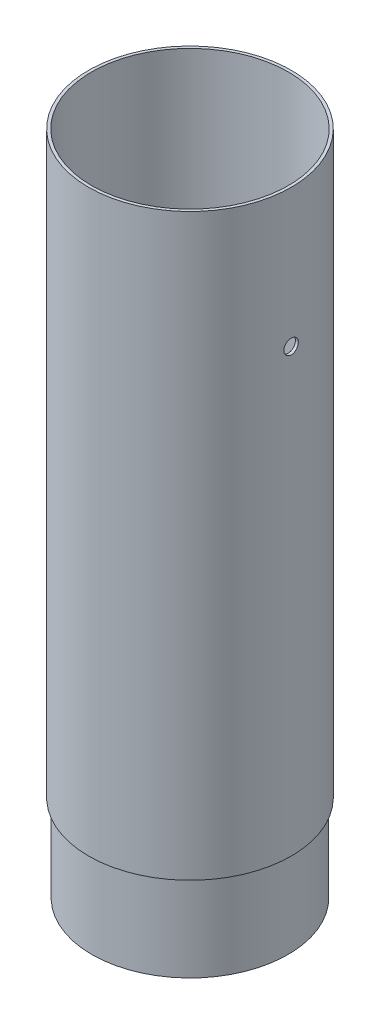
ISO-10303-21;
HEADER;
FILE_DESCRIPTION(('STEP AP214'),'2;1');
FILE_NAME('part.step','',(''),(''),'','','');
FILE_SCHEMA(('AUTOMOTIVE_DESIGN { 1 0 10303 214 1 1 1 1 }'));
ENDSEC;
DATA;
#1=APPLICATION_CONTEXT('core data for automotive mechanical design processes');
#2=APPLICATION_PROTOCOL_DEFINITION('international standard','automotive_design',2000,#1);
#3=PRODUCT_CONTEXT('',#1,'mechanical');
#4=PRODUCT('Part','Part','',(#3));
#5=PRODUCT_RELATED_PRODUCT_CATEGORY('part','',(#4));
#6=PRODUCT_DEFINITION_FORMATION('','',#4);
#7=PRODUCT_DEFINITION_CONTEXT('part definition',#1,'design');
#8=PRODUCT_DEFINITION('design','',#6,#7);
#9=PRODUCT_DEFINITION_SHAPE('','',#8);
#10=(LENGTH_UNIT() NAMED_UNIT(*) SI_UNIT(.MILLI.,.METRE.));
#11=(NAMED_UNIT(*) PLANE_ANGLE_UNIT() SI_UNIT($,.RADIAN.));
#12=(NAMED_UNIT(*) SI_UNIT($,.STERADIAN.) SOLID_ANGLE_UNIT());
#13=UNCERTAINTY_MEASURE_WITH_UNIT(LENGTH_MEASURE(1.E-05),#10,'distance_accuracy_value','');
#14=(GEOMETRIC_REPRESENTATION_CONTEXT(3) GLOBAL_UNCERTAINTY_ASSIGNED_CONTEXT((#13)) GLOBAL_UNIT_ASSIGNED_CONTEXT((#10,
#11,#12)) REPRESENTATION_CONTEXT('',''));
#15=CARTESIAN_POINT('',(0.,0.,0.));
#16=DIRECTION('',(0.,0.,1.));
#17=DIRECTION('',(1.,0.,0.));
#18=AXIS2_PLACEMENT_3D('',#15,#16,#17);
#19=CARTESIAN_POINT('',(0.,200.,0.));
#20=DIRECTION('',(0.,-1.,0.));
#21=DIRECTION('',(0.,0.,-1.));
#22=AXIS2_PLACEMENT_3D('',#19,#20,#21);
#23=CYLINDRICAL_SURFACE('',#22,34.);
#24=CARTESIAN_POINT('',(0.,2.,0.));
#25=DIRECTION('',(0.,-1.,0.));
#26=DIRECTION('',(0.,0.,-1.));
#27=AXIS2_PLACEMENT_3D('',#24,#25,#26);
#28=CIRCLE('',#27,34.);
#29=CARTESIAN_POINT('',(0.,2.,-34.));
#30=VERTEX_POINT('',#29);
#31=EDGE_CURVE('E62',#30,#30,#28,.T.);
#32=ORIENTED_EDGE('',*,*,#31,.T.);
#33=EDGE_LOOP('',(#32));
#34=FACE_BOUND('',#33,.T.);
#35=CARTESIAN_POINT('',(0.,200.,0.));
#36=DIRECTION('',(0.,1.,0.));
#37=DIRECTION('',(0.,0.,1.));
#38=AXIS2_PLACEMENT_3D('',#35,#36,#37);
#39=CIRCLE('',#38,34.);
#40=CARTESIAN_POINT('',(0.,200.,34.));
#41=VERTEX_POINT('',#40);
#42=EDGE_CURVE('E58',#41,#41,#39,.T.);
#43=ORIENTED_EDGE('',*,*,#42,.T.);
#44=EDGE_LOOP('',(#43));
#45=FACE_BOUND('',#44,.T.);
#46=CARTESIAN_POINT('',(33.907963666372,152.404493747876,2.5));
#47=CARTESIAN_POINT('',(33.9079648918879,152.264271450873,2.49999385115886));
#48=CARTESIAN_POINT('',(33.9088428338827,152.123952313681,2.48816295773379));
#49=CARTESIAN_POINT('',(33.9122599324509,151.84719249102,2.44113919356769));
#50=CARTESIAN_POINT('',(33.9148009972329,151.710756448743,2.40591948664322));
#51=CARTESIAN_POINT('',(33.9212549777814,151.445811534043,2.31313865752579));
#52=CARTESIAN_POINT('',(33.9251671428328,151.317298368816,2.25558975933475));
#53=CARTESIAN_POINT('',(33.9339215730292,151.07178802686,2.11980492745823));
#54=CARTESIAN_POINT('',(33.9387636321237,150.954788307596,2.04157357524779));
#55=CARTESIAN_POINT('',(33.9488433291914,150.735356606308,1.86647210116298));
#56=CARTESIAN_POINT('',(33.9540816616156,150.632951149881,1.76956877533338));
#57=CARTESIAN_POINT('',(33.9643572699528,150.445842398467,1.55994366867853));
#58=CARTESIAN_POINT('',(33.9693945372775,150.361139858988,1.4472212130832));
#59=CARTESIAN_POINT('',(33.9787067818083,150.211755932969,1.20900300569948));
#60=CARTESIAN_POINT('',(33.9829808992197,150.147097068823,1.08349309389431));
#61=CARTESIAN_POINT('',(33.9902778466821,150.039780028755,0.823361768729553));
#62=CARTESIAN_POINT('',(33.9933006943227,149.997121543561,0.688740483483281));
#63=CARTESIAN_POINT('',(33.9977496760966,149.935091358264,0.414468302760049));
#64=CARTESIAN_POINT('',(33.9991787133142,149.915677314253,0.274827031735735));
#65=CARTESIAN_POINT('',(34.0002888699552,149.900556271288,-0.00573895675876239));
#66=CARTESIAN_POINT('',(33.9999700154102,149.904848919267,-0.146663655083535));
#67=CARTESIAN_POINT('',(33.9976227233411,149.936984633939,-0.425509205847037));
#68=CARTESIAN_POINT('',(33.9955975917014,149.964782160679,-0.563435338255793));
#69=CARTESIAN_POINT('',(33.9900694375711,150.043067822714,-0.832658708515003));
#70=CARTESIAN_POINT('',(33.9865664036868,150.09355613294,-0.963955895251886));
#71=CARTESIAN_POINT('',(33.9784710074613,150.215841351834,-1.21633989933395));
#72=CARTESIAN_POINT('',(33.9738775970633,150.287658778575,-1.33741674027552));
#73=CARTESIAN_POINT('',(33.9641180316301,150.450548689405,-1.56581421256311));
#74=CARTESIAN_POINT('',(33.9589518675936,150.541621476129,-1.67313462765772));
#75=CARTESIAN_POINT('',(33.9486133725684,150.74069382199,-1.87123884571429));
#76=CARTESIAN_POINT('',(33.9434410559196,150.848732929844,-1.96198291215598));
#77=CARTESIAN_POINT('',(33.9336855761844,151.078532890997,-2.12405186355943));
#78=CARTESIAN_POINT('',(33.9291024134423,151.200293752314,-2.19537673717448));
#79=CARTESIAN_POINT('',(33.9210430700317,151.45410744316,-2.31658047391812));
#80=CARTESIAN_POINT('',(33.9175669856576,151.586161166728,-2.3664574716278));
#81=CARTESIAN_POINT('',(33.9121169953829,151.856799631658,-2.4433212199658));
#82=CARTESIAN_POINT('',(33.910143064966,151.995384266393,-2.47030834417309));
#83=CARTESIAN_POINT('',(33.9079246237389,152.274803490742,-2.50057638080411));
#84=CARTESIAN_POINT('',(33.9076760769926,152.415632056793,-2.50391261665755));
#85=CARTESIAN_POINT('',(33.908925879665,152.695846619324,-2.48692890414879));
#86=CARTESIAN_POINT('',(33.9104242164443,152.835232626234,-2.46660912694516));
#87=CARTESIAN_POINT('',(33.9149952665532,153.108447797837,-2.4029362298222));
#88=CARTESIAN_POINT('',(33.9180662267465,153.242282971299,-2.35960875654355));
#89=CARTESIAN_POINT('',(33.9254350116868,153.500783184817,-2.25117639736865));
#90=CARTESIAN_POINT('',(33.9297328518108,153.625448109915,-2.18607123852401));
#91=CARTESIAN_POINT('',(33.9390808988767,153.86232270165,-2.03579091157234));
#92=CARTESIAN_POINT('',(33.9441324853179,153.974508858526,-1.95057877403379));
#93=CARTESIAN_POINT('',(33.9544140610424,154.183004147637,-1.76255695014023));
#94=CARTESIAN_POINT('',(33.959644052723,154.27931306642,-1.65974702724053));
#95=CARTESIAN_POINT('',(33.9697050443321,154.453507869419,-1.43920944320117));
#96=CARTESIAN_POINT('',(33.9745352556936,154.531357881846,-1.32145340732261));
#97=CARTESIAN_POINT('',(33.9832411025386,154.666179208989,-1.07450828926196));
#98=CARTESIAN_POINT('',(33.9871167457291,154.723150692269,-0.945319299395866));
#99=CARTESIAN_POINT('',(33.9934730844645,154.814535740217,-0.679305699153807));
#100=CARTESIAN_POINT('',(33.995955167632,154.848971750018,-0.542488833958011));
#101=CARTESIAN_POINT('',(33.9992503091375,154.894381746246,-0.264996257550447));
#102=CARTESIAN_POINT('',(34.0000633913812,154.905356068724,-0.124320601638866));
#103=CARTESIAN_POINT('',(33.9999289754249,154.903527614942,0.156541992823156));
#104=CARTESIAN_POINT('',(33.9989856252468,154.890780858838,0.296729301480555));
#105=CARTESIAN_POINT('',(33.9954525921598,154.841988567489,0.572966909930298));
#106=CARTESIAN_POINT('',(33.9928629066461,154.805942995378,0.709017203176361));
#107=CARTESIAN_POINT('',(33.9863280163303,154.711589768643,0.973124722063291));
#108=CARTESIAN_POINT('',(33.9823828507412,154.65328275802,1.10118217880427));
#109=CARTESIAN_POINT('',(33.973579167729,154.516068695787,1.34569872415968));
#110=CARTESIAN_POINT('',(33.9687206694065,154.437162074968,1.46215805525034));
#111=CARTESIAN_POINT('',(33.9586225900774,154.2607792947,1.6804583496611));
#112=CARTESIAN_POINT('',(33.953382181388,154.163262014711,1.78226604940155));
#113=CARTESIAN_POINT('',(33.9431178331084,153.952493420285,1.96810537163221));
#114=CARTESIAN_POINT('',(33.9380939465238,153.839238281492,2.05213266086138));
#115=CARTESIAN_POINT('',(33.9288229192452,153.600035295228,2.20011324041026));
#116=CARTESIAN_POINT('',(33.9245769941091,153.474068053446,2.26403522617316));
#117=CARTESIAN_POINT('',(33.9173577687116,153.213246447451,2.36974160681816));
#118=CARTESIAN_POINT('',(33.914382992203,153.078402603354,2.41155169482286));
#119=CARTESIAN_POINT('',(33.9108153324977,152.853038994167,2.46108809300857));
#120=CARTESIAN_POINT('',(33.9097508037713,152.763972513233,2.47566092969208));
#121=CARTESIAN_POINT('',(33.9083245774052,152.584781949253,2.49511885034471));
#122=CARTESIAN_POINT('',(33.9079628783549,152.49465786833,2.50000395375675));
#123=CARTESIAN_POINT('',(33.907963666372,152.404493747876,2.5));
#124=B_SPLINE_CURVE_WITH_KNOTS('',3,(#46,#47,#48,#49,#50,#51,#52,#53,#54,#55,#56,#57,#58,#59,
#60,#61,#62,#63,#64,#65,#66,#67,#68,#69,#70,#71,#72,#73,#74,#75,#76,#77,#78,#79,#80,#81,#82,#83,
#84,#85,#86,#87,#88,#89,#90,#91,#92,#93,#94,#95,#96,#97,#98,#99,#100,#101,#102,#103,#104,#105,
#106,#107,#108,#109,#110,#111,#112,#113,#114,#115,#116,#117,#118,#119,#120,#121,#122,#123),
.UNSPECIFIED.,.T.,.F.,(4,2,2,2,2,2,2,2,2,2,2,2,2,2,2,2,2,2,2,2,2,2,2,2,2,2,2,2,2,2,2,2,2,2,2,2,
2,2,4),(0.,0.420337711220763,0.841158550622415,1.26174933810786,1.68224703634958,
2.10349951483656,2.52476996744881,2.9465120856445,3.3682482750342,3.78921502191645,
4.21017549931768,4.6303222430804,5.05047222595871,5.4710276989404,5.8915897822557,
6.31314716518915,6.73470479443961,7.15629908105415,7.57788648681858,7.9984874019252,
8.41908527387311,8.83921528722136,9.25935056642374,9.68026442516074,10.1011839421526,
10.5229148616212,10.9446423761116,11.3659492118039,11.7872500129145,12.2075571243501,
12.6278649008317,13.04816051915,13.4684473487119,13.8896737910458,14.3110027724763,
14.7329845648351,15.1544749482645,15.4247561866912,15.6950368826727),.UNSPECIFIED.);
#125=CARTESIAN_POINT('',(33.907963666372,152.404493747876,2.5));
#126=VERTEX_POINT('',#125);
#127=EDGE_CURVE('E74',#126,#126,#124,.T.);
#128=ORIENTED_EDGE('',*,*,#127,.T.);
#129=EDGE_LOOP('',(#128));
#130=FACE_BOUND('',#129,.T.);
#131=ADVANCED_FACE('F37',(#34,#45,#130),#23,.F.);
#132=CARTESIAN_POINT('',(0.,200.,0.));
#133=DIRECTION('',(0.,-1.,0.));
#134=DIRECTION('',(0.,0.,-1.));
#135=AXIS2_PLACEMENT_3D('',#132,#133,#134);
#136=CYLINDRICAL_SURFACE('',#135,35.);
#137=CARTESIAN_POINT('',(0.,200.,0.));
#138=DIRECTION('',(0.,1.,0.));
#139=DIRECTION('',(0.,0.,1.));
#140=AXIS2_PLACEMENT_3D('',#137,#138,#139);
#141=CIRCLE('',#140,35.);
#142=CARTESIAN_POINT('',(0.,200.,35.));
#143=VERTEX_POINT('',#142);
#144=EDGE_CURVE('E50',#143,#143,#141,.T.);
#145=ORIENTED_EDGE('',*,*,#144,.F.);
#146=EDGE_LOOP('',(#145));
#147=FACE_BOUND('',#146,.T.);
#148=CARTESIAN_POINT('',(0.,0.,0.));
#149=DIRECTION('',(0.,1.,0.));
#150=DIRECTION('',(0.,0.,1.));
#151=AXIS2_PLACEMENT_3D('',#148,#149,#150);
#152=CIRCLE('',#151,35.);
#153=CARTESIAN_POINT('',(0.,0.,35.));
#154=VERTEX_POINT('',#153);
#155=EDGE_CURVE('E54',#154,#154,#152,.T.);
#156=ORIENTED_EDGE('',*,*,#155,.T.);
#157=EDGE_LOOP('',(#156));
#158=FACE_BOUND('',#157,.T.);
#159=CARTESIAN_POINT('',(34.9106001094224,152.404493747876,2.5));
#160=CARTESIAN_POINT('',(34.9106013009842,152.264259963494,2.49999384622089));
#161=CARTESIAN_POINT('',(34.9114541660582,152.12392905807,2.48816102267757));
#162=CARTESIAN_POINT('',(34.9147737042987,151.847145233951,2.44112914296743));
#163=CARTESIAN_POINT('',(34.9172422362129,151.710696970945,2.40590317341537));
#164=CARTESIAN_POINT('',(34.9235120866206,151.445727550525,2.3131047340597));
#165=CARTESIAN_POINT('',(34.9273126809974,151.317202130756,2.25554440352311));
#166=CARTESIAN_POINT('',(34.935817508379,151.071669697386,2.11973160545789));
#167=CARTESIAN_POINT('',(34.9405215398181,150.954660123276,2.04148375205725));
#168=CARTESIAN_POINT('',(34.9503133990893,150.73522356434,1.86635343582881));
#169=CARTESIAN_POINT('',(34.9554018656616,150.632821703223,1.76943952624668));
#170=CARTESIAN_POINT('',(34.9653833491045,150.445722784868,1.55979386399035));
#171=CARTESIAN_POINT('',(34.9702763576651,150.361026479743,1.44706143970107));
#172=CARTESIAN_POINT('',(34.979321378548,150.211662689781,1.20883323290625));
#173=CARTESIAN_POINT('',(34.9834726035498,150.147016432933,1.08332410847659));
#174=CARTESIAN_POINT('',(34.990559516592,150.039723649896,0.823198604146603));
#175=CARTESIAN_POINT('',(34.9934952208912,149.99707682944,0.688582346091654));
#176=CARTESIAN_POINT('',(34.9978158775822,149.935064425968,0.41430967348407));
#177=CARTESIAN_POINT('',(34.9992034916227,149.915658879738,0.274662337109951));
#178=CARTESIAN_POINT('',(35.0002806084736,149.900556412171,-0.00591390353004123));
#179=CARTESIAN_POINT('',(34.9999701353268,149.904859155156,-0.146842789622615));
#180=CARTESIAN_POINT('',(34.9976882707688,149.93701827952,-0.425710880401191));
#181=CARTESIAN_POINT('',(34.9957199102546,149.964831679797,-0.563655069919057));
#182=CARTESIAN_POINT('',(34.9903472796657,150.043155846207,-0.832911896068628));
#183=CARTESIAN_POINT('',(34.9869429990408,150.093666779109,-0.964224483967661));
#184=CARTESIAN_POINT('',(34.9790764811396,150.216000560148,-1.21662813510536));
#185=CARTESIAN_POINT('',(34.9746132821527,150.287842796399,-1.33770977022083));
#186=CARTESIAN_POINT('',(34.9651309405076,150.450785756796,-1.56611151883488));
#187=CARTESIAN_POINT('',(34.9601117896154,150.541886766193,-1.67343142846341));
#188=CARTESIAN_POINT('',(34.9500688682286,150.741003800185,-1.87151434561124));
#189=CARTESIAN_POINT('',(34.945045112451,150.849057147096,-1.96223984092648));
#190=CARTESIAN_POINT('',(34.9355705444722,151.078881135,-2.1242691127521));
#191=CARTESIAN_POINT('',(34.931119732582,151.200651783437,-2.19557287872281));
#192=CARTESIAN_POINT('',(34.923293875589,151.454478581857,-2.31673245908851));
#193=CARTESIAN_POINT('',(34.9199189169749,151.586535557706,-2.36658654923886));
#194=CARTESIAN_POINT('',(34.9146282757894,151.857174827485,-2.4434049696103));
#195=CARTESIAN_POINT('',(34.9127125707554,151.995757020937,-2.47036965217411));
#196=CARTESIAN_POINT('',(34.9105607163688,152.275185268371,-2.50059679826771));
#197=CARTESIAN_POINT('',(34.9103208674152,152.416025647297,-2.50391147163281));
#198=CARTESIAN_POINT('',(34.911538102081,152.696260254137,-2.48688105832807));
#199=CARTESIAN_POINT('',(34.9129951741237,152.835654491912,-2.4665361330675));
#200=CARTESIAN_POINT('',(34.9174386845258,153.108891405354,-2.40280747129512));
#201=CARTESIAN_POINT('',(34.9204235182308,153.242739746915,-2.35944790599135));
#202=CARTESIAN_POINT('',(34.9275848607993,153.501260537478,-2.25094529934471));
#203=CARTESIAN_POINT('',(34.9317613837642,153.625932877876,-2.18580200022983));
#204=CARTESIAN_POINT('',(34.9408444549612,153.862802145509,-2.03544819945194));
#205=CARTESIAN_POINT('',(34.9457522675833,153.974976865523,-1.95020278976709));
#206=CARTESIAN_POINT('',(34.9557405275265,154.1834426672,-1.76211522324266));
#207=CARTESIAN_POINT('',(34.9608209770392,154.279733547125,-1.65927284293909));
#208=CARTESIAN_POINT('',(34.9705929477922,154.45387541242,-1.43868558630043));
#209=CARTESIAN_POINT('',(34.9752837452292,154.531692558568,-1.32091395926635));
#210=CARTESIAN_POINT('',(34.9837374668193,154.66644621515,-1.07394533913419));
#211=CARTESIAN_POINT('',(34.9875003981072,154.723382886144,-0.944748433899824));
#212=CARTESIAN_POINT('',(34.9936710038533,154.814700798644,-0.678719845089269));
#213=CARTESIAN_POINT('',(34.9960799531813,154.849103262763,-0.541895477216701));
#214=CARTESIAN_POINT('',(34.9992762933682,154.894445619809,-0.264394743307918));
#215=CARTESIAN_POINT('',(35.0000637059758,154.905385827422,-0.123718428961316));
#216=CARTESIAN_POINT('',(34.9999283072413,154.903489852515,0.157158551507445));
#217=CARTESIAN_POINT('',(34.9990092986799,154.890706538189,0.297359579385099));
#218=CARTESIAN_POINT('',(34.9955718973575,154.841836259151,0.57361871666884));
#219=CARTESIAN_POINT('',(34.9930535020032,154.805749256655,0.70967681935717));
#220=CARTESIAN_POINT('',(34.9867001855665,154.711308562873,0.973793948539721));
#221=CARTESIAN_POINT('',(34.9828652960377,154.652955405256,1.1018531666635));
#222=CARTESIAN_POINT('',(34.974308953845,154.515645493009,1.34636475268572));
#223=CARTESIAN_POINT('',(34.9695875206225,154.43668919018,1.46281737502472));
#224=CARTESIAN_POINT('',(34.9597762099301,154.260216990779,1.68107963152584));
#225=CARTESIAN_POINT('',(34.9546855778527,154.162662378573,1.78285792822938));
#226=CARTESIAN_POINT('',(34.9447158885714,153.951824375959,1.96863172921552));
#227=CARTESIAN_POINT('',(34.9398368832279,153.838537158436,2.05262289400754));
#228=CARTESIAN_POINT('',(34.9308348795402,153.599285170802,2.20052035377929));
#229=CARTESIAN_POINT('',(34.9267130155451,153.473301809624,2.26439661324422));
#230=CARTESIAN_POINT('',(34.9197061867511,153.212458277197,2.37001000657716));
#231=CARTESIAN_POINT('',(34.9168197844766,153.07760863398,2.41177288314436));
#232=CARTESIAN_POINT('',(34.9133616093181,152.85237004228,2.46120496726511));
#233=CARTESIAN_POINT('',(34.9123307263929,152.763434299889,2.47573408624047));
#234=CARTESIAN_POINT('',(34.9109495946006,152.584510295705,2.49513356886052));
#235=CARTESIAN_POINT('',(34.910599344455,152.494522035888,2.50000395064713));
#236=CARTESIAN_POINT('',(34.9106001094224,152.404493747876,2.5));
#237=B_SPLINE_CURVE_WITH_KNOTS('',3,(#159,#160,#161,#162,#163,#164,#165,#166,#167,#168,#169,
#170,#171,#172,#173,#174,#175,#176,#177,#178,#179,#180,#181,#182,#183,#184,#185,#186,#187,#188,
#189,#190,#191,#192,#193,#194,#195,#196,#197,#198,#199,#200,#201,#202,#203,#204,#205,#206,#207,
#208,#209,#210,#211,#212,#213,#214,#215,#216,#217,#218,#219,#220,#221,#222,#223,#224,#225,#226,
#227,#228,#229,#230,#231,#232,#233,#234,#235,#236),.UNSPECIFIED.,.T.,.F.,(4,2,2,2,2,2,2,2,2,2,2,
2,2,2,2,2,2,2,2,2,2,2,2,2,2,2,2,2,2,2,2,2,2,2,2,2,2,2,4),(0.,0.420372674340728,
0.841229819528204,1.26185853834788,1.68239351951576,2.10364327403619,2.5249109191957,
2.94662307084332,3.3683295814714,3.78930992470612,4.21028430741625,4.63049074442442,
5.05070026889244,5.47129289888783,5.89189175894008,6.31342995236852,6.73496837455423,
7.15654067602211,7.57810648799807,7.99874136118447,8.41937336475454,8.83956446964646,
9.2597605469339,9.68069175383478,10.101628306539,10.5233300601264,10.9450285709861,
11.3663293548796,11.7876244880683,12.2079818864761,12.6283399664575,13.0486879720404,
13.4690267606992,13.8902503059564,14.311576498183,14.7335288625457,15.1549889364476,
15.4248632998188,15.694737156287),.UNSPECIFIED.);
#238=CARTESIAN_POINT('',(34.9106001094224,152.404493747876,2.5));
#239=VERTEX_POINT('',#238);
#240=EDGE_CURVE('E42',#239,#239,#237,.T.);
#241=ORIENTED_EDGE('',*,*,#240,.F.);
#242=EDGE_LOOP('',(#241));
#243=FACE_BOUND('',#242,.T.);
#244=ADVANCED_FACE('F39',(#147,#158,#243),#136,.T.);
#245=CARTESIAN_POINT('',(0.,0.,0.));
#246=DIRECTION('',(0.,1.,0.));
#247=DIRECTION('',(0.,0.,1.));
#248=AXIS2_PLACEMENT_3D('',#245,#246,#247);
#249=PLANE('',#248);
#250=ORIENTED_EDGE('',*,*,#155,.F.);
#251=EDGE_LOOP('',(#250));
#252=FACE_BOUND('',#251,.T.);
#253=CARTESIAN_POINT('',(0.,0.,0.));
#254=DIRECTION('',(0.,1.,0.));
#255=DIRECTION('',(0.,0.,1.));
#256=AXIS2_PLACEMENT_3D('',#253,#254,#255);
#257=CIRCLE('',#256,33.9);
#258=CARTESIAN_POINT('',(0.,0.,33.9));
#259=VERTEX_POINT('',#258);
#260=EDGE_CURVE('E10',#259,#259,#257,.F.);
#261=ORIENTED_EDGE('',*,*,#260,.F.);
#262=EDGE_LOOP('',(#261));
#263=FACE_BOUND('',#262,.T.);
#264=ADVANCED_FACE('F107',(#252,#263),#249,.F.);
#265=CARTESIAN_POINT('',(0.,200.,0.));
#266=DIRECTION('',(0.,1.,0.));
#267=DIRECTION('',(0.,0.,1.));
#268=AXIS2_PLACEMENT_3D('',#265,#266,#267);
#269=PLANE('',#268);
#270=ORIENTED_EDGE('',*,*,#144,.T.);
#271=EDGE_LOOP('',(#270));
#272=FACE_BOUND('',#271,.T.);
#273=ORIENTED_EDGE('',*,*,#42,.F.);
#274=EDGE_LOOP('',(#273));
#275=FACE_BOUND('',#274,.T.);
#276=ADVANCED_FACE('F102',(#272,#275),#269,.T.);
#277=CARTESIAN_POINT('',(0.,2.,0.));
#278=DIRECTION('',(0.,-1.,0.));
#279=DIRECTION('',(0.,0.,-1.));
#280=AXIS2_PLACEMENT_3D('',#277,#278,#279);
#281=PLANE('',#280);
#282=CARTESIAN_POINT('',(0.,2.,0.));
#283=DIRECTION('',(0.,-1.,0.));
#284=DIRECTION('',(0.,0.,-1.));
#285=AXIS2_PLACEMENT_3D('',#282,#283,#284);
#286=CIRCLE('',#285,32.9);
#287=CARTESIAN_POINT('',(0.,2.,-32.9));
#288=VERTEX_POINT('',#287);
#289=EDGE_CURVE('E65',#288,#288,#286,.T.);
#290=ORIENTED_EDGE('',*,*,#289,.T.);
#291=EDGE_LOOP('',(#290));
#292=FACE_BOUND('',#291,.T.);
#293=ORIENTED_EDGE('',*,*,#31,.F.);
#294=EDGE_LOOP('',(#293));
#295=FACE_BOUND('',#294,.T.);
#296=ADVANCED_FACE('F99',(#292,#295),#281,.F.);
#297=CARTESIAN_POINT('',(0.,2.,0.));
#298=DIRECTION('',(0.,-1.,0.));
#299=DIRECTION('',(0.,0.,-1.));
#300=AXIS2_PLACEMENT_3D('',#297,#298,#299);
#301=CYLINDRICAL_SURFACE('',#300,32.9);
#302=ORIENTED_EDGE('',*,*,#289,.F.);
#303=EDGE_LOOP('',(#302));
#304=FACE_BOUND('',#303,.T.);
#305=CARTESIAN_POINT('',(0.,-30.,0.));
#306=DIRECTION('',(0.,-1.,0.));
#307=DIRECTION('',(0.,0.,-1.));
#308=AXIS2_PLACEMENT_3D('',#305,#306,#307);
#309=CIRCLE('',#308,32.9);
#310=CARTESIAN_POINT('',(0.,-30.,-32.9));
#311=VERTEX_POINT('',#310);
#312=EDGE_CURVE('E71',#311,#311,#309,.T.);
#313=ORIENTED_EDGE('',*,*,#312,.T.);
#314=EDGE_LOOP('',(#313));
#315=FACE_BOUND('',#314,.T.);
#316=ADVANCED_FACE('F93',(#304,#315),#301,.F.);
#317=CARTESIAN_POINT('',(0.,-30.,0.));
#318=DIRECTION('',(0.,-1.,0.));
#319=DIRECTION('',(0.,0.,-1.));
#320=AXIS2_PLACEMENT_3D('',#317,#318,#319);
#321=PLANE('',#320);
#322=CARTESIAN_POINT('',(0.,-30.,0.));
#323=DIRECTION('',(0.,-1.,0.));
#324=DIRECTION('',(0.,0.,-1.));
#325=AXIS2_PLACEMENT_3D('',#322,#323,#324);
#326=CIRCLE('',#325,33.9);
#327=CARTESIAN_POINT('',(0.,-30.,-33.9));
#328=VERTEX_POINT('',#327);
#329=EDGE_CURVE('E68',#328,#328,#326,.T.);
#330=ORIENTED_EDGE('',*,*,#329,.T.);
#331=EDGE_LOOP('',(#330));
#332=FACE_BOUND('',#331,.T.);
#333=ORIENTED_EDGE('',*,*,#312,.F.);
#334=EDGE_LOOP('',(#333));
#335=FACE_BOUND('',#334,.T.);
#336=ADVANCED_FACE('F89',(#332,#335),#321,.T.);
#337=CARTESIAN_POINT('',(0.,-30.,0.));
#338=DIRECTION('',(0.,1.,0.));
#339=DIRECTION('',(0.,0.,1.));
#340=AXIS2_PLACEMENT_3D('',#337,#338,#339);
#341=CYLINDRICAL_SURFACE('',#340,33.9);
#342=ORIENTED_EDGE('',*,*,#329,.F.);
#343=EDGE_LOOP('',(#342));
#344=FACE_BOUND('',#343,.T.);
#345=ORIENTED_EDGE('',*,*,#260,.T.);
#346=EDGE_LOOP('',(#345));
#347=FACE_BOUND('',#346,.T.);
#348=ADVANCED_FACE('F87',(#344,#347),#341,.T.);
#349=CARTESIAN_POINT('',(40.,152.404493747876,0.));
#350=DIRECTION('',(-1.,0.,0.));
#351=DIRECTION('',(0.,0.,1.));
#352=AXIS2_PLACEMENT_3D('',#349,#350,#351);
#353=CYLINDRICAL_SURFACE('',#352,2.5);
#354=ORIENTED_EDGE('',*,*,#127,.F.);
#355=EDGE_LOOP('',(#354));
#356=FACE_BOUND('',#355,.T.);
#357=ORIENTED_EDGE('',*,*,#240,.T.);
#358=EDGE_LOOP('',(#357));
#359=FACE_BOUND('',#358,.T.);
#360=ADVANCED_FACE('F83',(#356,#359),#353,.F.);
#361=CLOSED_SHELL('',(#131,#244,#264,#276,#296,#316,#336,#348,#360));
#362=MANIFOLD_SOLID_BREP('B2',#361);
#363=ADVANCED_BREP_SHAPE_REPRESENTATION('',(#18,#362),#14);
#364=SHAPE_DEFINITION_REPRESENTATION(#9,#363);
ENDSEC;
END-ISO-10303-21;
